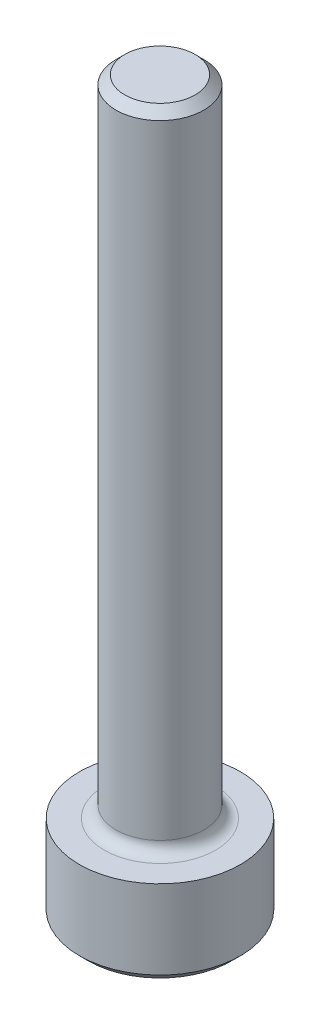
ISO-10303-21;
HEADER;
FILE_DESCRIPTION(('STEP AP214'),'2;1');
FILE_NAME('part.step','',(''),(''),'','','');
FILE_SCHEMA(('AUTOMOTIVE_DESIGN { 1 0 10303 214 1 1 1 1 }'));
ENDSEC;
DATA;
#1=APPLICATION_CONTEXT('core data for automotive mechanical design processes');
#2=APPLICATION_PROTOCOL_DEFINITION('international standard','automotive_design',2000,#1);
#3=PRODUCT_CONTEXT('',#1,'mechanical');
#4=PRODUCT('Part','Part','',(#3));
#5=PRODUCT_RELATED_PRODUCT_CATEGORY('part','',(#4));
#6=PRODUCT_DEFINITION_FORMATION('','',#4);
#7=PRODUCT_DEFINITION_CONTEXT('part definition',#1,'design');
#8=PRODUCT_DEFINITION('design','',#6,#7);
#9=PRODUCT_DEFINITION_SHAPE('','',#8);
#10=(LENGTH_UNIT() NAMED_UNIT(*) SI_UNIT(.MILLI.,.METRE.));
#11=(NAMED_UNIT(*) PLANE_ANGLE_UNIT() SI_UNIT($,.RADIAN.));
#12=(NAMED_UNIT(*) SI_UNIT($,.STERADIAN.) SOLID_ANGLE_UNIT());
#13=UNCERTAINTY_MEASURE_WITH_UNIT(LENGTH_MEASURE(1.E-05),#10,'distance_accuracy_value','');
#14=(GEOMETRIC_REPRESENTATION_CONTEXT(3) GLOBAL_UNCERTAINTY_ASSIGNED_CONTEXT((#13)) GLOBAL_UNIT_ASSIGNED_CONTEXT((#10,
#11,#12)) REPRESENTATION_CONTEXT('',''));
#15=CARTESIAN_POINT('',(0.,0.,0.));
#16=DIRECTION('',(0.,0.,1.));
#17=DIRECTION('',(1.,0.,0.));
#18=AXIS2_PLACEMENT_3D('',#15,#16,#17);
#19=CARTESIAN_POINT('',(0.,22.,0.));
#20=DIRECTION('',(0.,-1.,0.));
#21=DIRECTION('',(0.,0.,-1.));
#22=AXIS2_PLACEMENT_3D('',#19,#20,#21);
#23=CYLINDRICAL_SURFACE('',#22,1.5);
#24=CARTESIAN_POINT('',(0.,21.7,0.));
#25=DIRECTION('',(0.,1.,0.));
#26=DIRECTION('',(0.,0.,1.));
#27=AXIS2_PLACEMENT_3D('',#24,#25,#26);
#28=CIRCLE('',#27,1.5);
#29=CARTESIAN_POINT('',(0.,21.7,1.5));
#30=VERTEX_POINT('',#29);
#31=EDGE_CURVE('E11',#30,#30,#28,.F.);
#32=ORIENTED_EDGE('',*,*,#31,.T.);
#33=EDGE_LOOP('',(#32));
#34=FACE_BOUND('',#33,.T.);
#35=CARTESIAN_POINT('',(0.,0.400000000000001,0.));
#36=DIRECTION('',(0.,1.,0.));
#37=DIRECTION('',(0.,0.,1.));
#38=AXIS2_PLACEMENT_3D('',#35,#36,#37);
#39=CIRCLE('',#38,1.5);
#40=CARTESIAN_POINT('',(0.,0.400000000000001,1.5));
#41=VERTEX_POINT('',#40);
#42=EDGE_CURVE('E143',#41,#41,#39,.T.);
#43=ORIENTED_EDGE('',*,*,#42,.T.);
#44=EDGE_LOOP('',(#43));
#45=FACE_BOUND('',#44,.T.);
#46=ADVANCED_FACE('F33',(#34,#45),#23,.T.);
#47=CARTESIAN_POINT('',(0.,22.,0.));
#48=DIRECTION('',(0.,1.,0.));
#49=DIRECTION('',(0.,0.,1.));
#50=AXIS2_PLACEMENT_3D('',#47,#48,#49);
#51=PLANE('',#50);
#52=CARTESIAN_POINT('',(0.,22.,0.));
#53=DIRECTION('',(0.,1.,0.));
#54=DIRECTION('',(0.,0.,1.));
#55=AXIS2_PLACEMENT_3D('',#52,#53,#54);
#56=CIRCLE('',#55,1.2);
#57=CARTESIAN_POINT('',(0.,22.,1.2));
#58=VERTEX_POINT('',#57);
#59=EDGE_CURVE('E41',#58,#58,#56,.T.);
#60=ORIENTED_EDGE('',*,*,#59,.T.);
#61=EDGE_LOOP('',(#60));
#62=FACE_BOUND('',#61,.T.);
#63=ADVANCED_FACE('F157',(#62),#51,.T.);
#64=CARTESIAN_POINT('',(0.,-3.,0.));
#65=DIRECTION('',(0.,1.,0.));
#66=DIRECTION('',(0.,0.,1.));
#67=AXIS2_PLACEMENT_3D('',#64,#65,#66);
#68=CYLINDRICAL_SURFACE('',#67,2.75);
#69=CARTESIAN_POINT('',(0.,-2.7,0.));
#70=DIRECTION('',(0.,1.,0.));
#71=DIRECTION('',(0.,0.,1.));
#72=AXIS2_PLACEMENT_3D('',#69,#70,#71);
#73=CIRCLE('',#72,2.75);
#74=CARTESIAN_POINT('',(0.,-2.7,2.75));
#75=VERTEX_POINT('',#74);
#76=EDGE_CURVE('E149',#75,#75,#73,.T.);
#77=ORIENTED_EDGE('',*,*,#76,.T.);
#78=EDGE_LOOP('',(#77));
#79=FACE_BOUND('',#78,.T.);
#80=CARTESIAN_POINT('',(0.,0.,0.));
#81=DIRECTION('',(0.,1.,0.));
#82=DIRECTION('',(0.,0.,1.));
#83=AXIS2_PLACEMENT_3D('',#80,#81,#82);
#84=CIRCLE('',#83,2.75);
#85=CARTESIAN_POINT('',(0.,0.,2.75));
#86=VERTEX_POINT('',#85);
#87=EDGE_CURVE('E135',#86,#86,#84,.T.);
#88=ORIENTED_EDGE('',*,*,#87,.F.);
#89=EDGE_LOOP('',(#88));
#90=FACE_BOUND('',#89,.T.);
#91=ADVANCED_FACE('F178',(#79,#90),#68,.T.);
#92=CARTESIAN_POINT('',(0.,-3.,0.));
#93=DIRECTION('',(0.,1.,0.));
#94=DIRECTION('',(0.,0.,1.));
#95=AXIS2_PLACEMENT_3D('',#92,#93,#94);
#96=PLANE('',#95);
#97=DIRECTION('',(-0.866025403784439,0.,-0.5));
#98=VECTOR('',#97,1.);
#99=CARTESIAN_POINT('',(0.,-3.,1.44337567297406));
#100=LINE('',#99,#98);
#101=CARTESIAN_POINT('',(0.,-3.,1.44337567297406));
#102=VERTEX_POINT('',#101);
#103=CARTESIAN_POINT('',(-1.25,-3.,0.721687836487032));
#104=VERTEX_POINT('',#103);
#105=EDGE_CURVE('E122',#102,#104,#100,.T.);
#106=ORIENTED_EDGE('',*,*,#105,.F.);
#107=DIRECTION('',(-0.866025403784439,0.,0.5));
#108=VECTOR('',#107,1.);
#109=CARTESIAN_POINT('',(1.25,-3.,0.721687836487033));
#110=LINE('',#109,#108);
#111=CARTESIAN_POINT('',(1.25,-3.,0.721687836487033));
#112=VERTEX_POINT('',#111);
#113=EDGE_CURVE('E48',#112,#102,#110,.T.);
#114=ORIENTED_EDGE('',*,*,#113,.F.);
#115=DIRECTION('',(0.,0.,1.));
#116=VECTOR('',#115,1.);
#117=CARTESIAN_POINT('',(1.25,-3.,-0.721687836487033));
#118=LINE('',#117,#116);
#119=CARTESIAN_POINT('',(1.25,-3.,-0.721687836487033));
#120=VERTEX_POINT('',#119);
#121=EDGE_CURVE('E131',#120,#112,#118,.T.);
#122=ORIENTED_EDGE('',*,*,#121,.F.);
#123=DIRECTION('',(0.866025403784439,0.,0.5));
#124=VECTOR('',#123,1.);
#125=CARTESIAN_POINT('',(0.,-3.,-1.44337567297406));
#126=LINE('',#125,#124);
#127=CARTESIAN_POINT('',(0.,-3.,-1.44337567297406));
#128=VERTEX_POINT('',#127);
#129=EDGE_CURVE('E129',#128,#120,#126,.T.);
#130=ORIENTED_EDGE('',*,*,#129,.F.);
#131=DIRECTION('',(0.866025403784439,0.,-0.5));
#132=VECTOR('',#131,1.);
#133=CARTESIAN_POINT('',(-1.25,-3.,-0.721687836487033));
#134=LINE('',#133,#132);
#135=CARTESIAN_POINT('',(-1.25,-3.,-0.721687836487033));
#136=VERTEX_POINT('',#135);
#137=EDGE_CURVE('E96',#136,#128,#134,.T.);
#138=ORIENTED_EDGE('',*,*,#137,.F.);
#139=DIRECTION('',(0.,0.,-1.));
#140=VECTOR('',#139,1.);
#141=CARTESIAN_POINT('',(-1.25,-3.,0.721687836487032));
#142=LINE('',#141,#140);
#143=EDGE_CURVE('E125',#104,#136,#142,.T.);
#144=ORIENTED_EDGE('',*,*,#143,.F.);
#145=EDGE_LOOP('',(#106,#114,#122,#130,#138,#144));
#146=FACE_BOUND('',#145,.T.);
#147=CARTESIAN_POINT('',(0.,-3.,0.));
#148=DIRECTION('',(0.,1.,0.));
#149=DIRECTION('',(0.,0.,1.));
#150=AXIS2_PLACEMENT_3D('',#147,#148,#149);
#151=CIRCLE('',#150,2.45);
#152=CARTESIAN_POINT('',(0.,-3.,2.45));
#153=VERTEX_POINT('',#152);
#154=EDGE_CURVE('E152',#153,#153,#151,.F.);
#155=ORIENTED_EDGE('',*,*,#154,.T.);
#156=EDGE_LOOP('',(#155));
#157=FACE_BOUND('',#156,.T.);
#158=ADVANCED_FACE('F189',(#146,#157),#96,.F.);
#159=CARTESIAN_POINT('',(0.,0.,0.));
#160=DIRECTION('',(0.,1.,0.));
#161=DIRECTION('',(0.,0.,1.));
#162=AXIS2_PLACEMENT_3D('',#159,#160,#161);
#163=PLANE('',#162);
#164=CARTESIAN_POINT('',(0.,0.,0.));
#165=DIRECTION('',(0.,1.,0.));
#166=DIRECTION('',(0.,0.,1.));
#167=AXIS2_PLACEMENT_3D('',#164,#165,#166);
#168=CIRCLE('',#167,1.9);
#169=CARTESIAN_POINT('',(0.,0.,1.9));
#170=VERTEX_POINT('',#169);
#171=EDGE_CURVE('E146',#170,#170,#168,.F.);
#172=ORIENTED_EDGE('',*,*,#171,.T.);
#173=EDGE_LOOP('',(#172));
#174=FACE_BOUND('',#173,.T.);
#175=ORIENTED_EDGE('',*,*,#87,.T.);
#176=EDGE_LOOP('',(#175));
#177=FACE_BOUND('',#176,.T.);
#178=ADVANCED_FACE('F184',(#174,#177),#163,.T.);
#179=CARTESIAN_POINT('',(0.,0.400000000000001,0.));
#180=DIRECTION('',(0.,1.,0.));
#181=DIRECTION('',(0.,0.,1.));
#182=AXIS2_PLACEMENT_3D('',#179,#180,#181);
#183=TOROIDAL_SURFACE('',#182,1.9,0.4);
#184=ORIENTED_EDGE('',*,*,#171,.F.);
#185=EDGE_LOOP('',(#184));
#186=FACE_BOUND('',#185,.T.);
#187=ORIENTED_EDGE('',*,*,#42,.F.);
#188=EDGE_LOOP('',(#187));
#189=FACE_BOUND('',#188,.T.);
#190=ADVANCED_FACE('F169',(#186,#189),#183,.F.);
#191=CARTESIAN_POINT('',(0.,-2.7,0.));
#192=DIRECTION('',(0.,1.,0.));
#193=DIRECTION('',(0.,0.,1.));
#194=AXIS2_PLACEMENT_3D('',#191,#192,#193);
#195=CONICAL_SURFACE('',#194,2.75,0.785398163397453);
#196=ORIENTED_EDGE('',*,*,#154,.F.);
#197=EDGE_LOOP('',(#196));
#198=FACE_BOUND('',#197,.T.);
#199=ORIENTED_EDGE('',*,*,#76,.F.);
#200=EDGE_LOOP('',(#199));
#201=FACE_BOUND('',#200,.T.);
#202=ADVANCED_FACE('F161',(#198,#201),#195,.T.);
#203=CARTESIAN_POINT('',(0.,22.,0.));
#204=DIRECTION('',(0.,-1.,0.));
#205=DIRECTION('',(0.,0.,-1.));
#206=AXIS2_PLACEMENT_3D('',#203,#204,#205);
#207=CONICAL_SURFACE('',#206,1.2,0.785398163397452);
#208=ORIENTED_EDGE('',*,*,#31,.F.);
#209=EDGE_LOOP('',(#208));
#210=FACE_BOUND('',#209,.T.);
#211=ORIENTED_EDGE('',*,*,#59,.F.);
#212=EDGE_LOOP('',(#211));
#213=FACE_BOUND('',#212,.T.);
#214=ADVANCED_FACE('F35',(#210,#213),#207,.T.);
#215=CARTESIAN_POINT('',(1.25,-0.5,0.721687836487033));
#216=DIRECTION('',(0.5,0.,0.866025403784439));
#217=DIRECTION('',(0.866025403784439,0.,-0.5));
#218=AXIS2_PLACEMENT_3D('',#215,#216,#217);
#219=PLANE('',#218);
#220=ORIENTED_EDGE('',*,*,#113,.T.);
#221=DIRECTION('',(0.,-1.,0.));
#222=VECTOR('',#221,1.);
#223=CARTESIAN_POINT('',(0.,-0.5,1.44337567297406));
#224=LINE('',#223,#222);
#225=CARTESIAN_POINT('',(0.,-0.5,1.44337567297406));
#226=VERTEX_POINT('',#225);
#227=EDGE_CURVE('E78',#226,#102,#224,.T.);
#228=ORIENTED_EDGE('',*,*,#227,.F.);
#229=DIRECTION('',(-0.866025403784439,0.,0.5));
#230=VECTOR('',#229,1.);
#231=CARTESIAN_POINT('',(1.25,-0.5,0.721687836487033));
#232=LINE('',#231,#230);
#233=CARTESIAN_POINT('',(1.25,-0.5,0.721687836487033));
#234=VERTEX_POINT('',#233);
#235=EDGE_CURVE('E133',#234,#226,#232,.T.);
#236=ORIENTED_EDGE('',*,*,#235,.F.);
#237=DIRECTION('',(0.,-1.,0.));
#238=VECTOR('',#237,1.);
#239=CARTESIAN_POINT('',(1.25,-0.5,0.721687836487033));
#240=LINE('',#239,#238);
#241=EDGE_CURVE('E56',#234,#112,#240,.T.);
#242=ORIENTED_EDGE('',*,*,#241,.T.);
#243=EDGE_LOOP('',(#220,#228,#236,#242));
#244=FACE_BOUND('',#243,.T.);
#245=ADVANCED_FACE('F160',(#244),#219,.F.);
#246=CARTESIAN_POINT('',(1.25,-0.5,-0.721687836487033));
#247=DIRECTION('',(1.,0.,0.));
#248=DIRECTION('',(0.,0.,-1.));
#249=AXIS2_PLACEMENT_3D('',#246,#247,#248);
#250=PLANE('',#249);
#251=ORIENTED_EDGE('',*,*,#121,.T.);
#252=ORIENTED_EDGE('',*,*,#241,.F.);
#253=DIRECTION('',(0.,0.,1.));
#254=VECTOR('',#253,1.);
#255=CARTESIAN_POINT('',(1.25,-0.5,-0.721687836487033));
#256=LINE('',#255,#254);
#257=CARTESIAN_POINT('',(1.25,-0.5,-0.721687836487033));
#258=VERTEX_POINT('',#257);
#259=EDGE_CURVE('E108',#258,#234,#256,.T.);
#260=ORIENTED_EDGE('',*,*,#259,.F.);
#261=DIRECTION('',(0.,-1.,0.));
#262=VECTOR('',#261,1.);
#263=CARTESIAN_POINT('',(1.25,-0.5,-0.721687836487033));
#264=LINE('',#263,#262);
#265=EDGE_CURVE('E100',#258,#120,#264,.T.);
#266=ORIENTED_EDGE('',*,*,#265,.T.);
#267=EDGE_LOOP('',(#251,#252,#260,#266));
#268=FACE_BOUND('',#267,.T.);
#269=ADVANCED_FACE('F167',(#268),#250,.F.);
#270=CARTESIAN_POINT('',(0.,-0.5,-1.44337567297406));
#271=DIRECTION('',(0.5,0.,-0.866025403784439));
#272=DIRECTION('',(-0.866025403784439,0.,-0.5));
#273=AXIS2_PLACEMENT_3D('',#270,#271,#272);
#274=PLANE('',#273);
#275=ORIENTED_EDGE('',*,*,#129,.T.);
#276=ORIENTED_EDGE('',*,*,#265,.F.);
#277=DIRECTION('',(0.866025403784439,0.,0.5));
#278=VECTOR('',#277,1.);
#279=CARTESIAN_POINT('',(0.,-0.5,-1.44337567297406));
#280=LINE('',#279,#278);
#281=CARTESIAN_POINT('',(0.,-0.5,-1.44337567297406));
#282=VERTEX_POINT('',#281);
#283=EDGE_CURVE('E104',#282,#258,#280,.T.);
#284=ORIENTED_EDGE('',*,*,#283,.F.);
#285=DIRECTION('',(0.,-1.,0.));
#286=VECTOR('',#285,1.);
#287=CARTESIAN_POINT('',(0.,-0.5,-1.44337567297406));
#288=LINE('',#287,#286);
#289=EDGE_CURVE('E89',#282,#128,#288,.T.);
#290=ORIENTED_EDGE('',*,*,#289,.T.);
#291=EDGE_LOOP('',(#275,#276,#284,#290));
#292=FACE_BOUND('',#291,.T.);
#293=ADVANCED_FACE('F105',(#292),#274,.F.);
#294=CARTESIAN_POINT('',(-1.25,-0.5,-0.721687836487033));
#295=DIRECTION('',(-0.5,0.,-0.866025403784439));
#296=DIRECTION('',(-0.866025403784439,0.,0.5));
#297=AXIS2_PLACEMENT_3D('',#294,#295,#296);
#298=PLANE('',#297);
#299=ORIENTED_EDGE('',*,*,#137,.T.);
#300=ORIENTED_EDGE('',*,*,#289,.F.);
#301=DIRECTION('',(0.866025403784439,0.,-0.5));
#302=VECTOR('',#301,1.);
#303=CARTESIAN_POINT('',(-1.25,-0.5,-0.721687836487033));
#304=LINE('',#303,#302);
#305=CARTESIAN_POINT('',(-1.25,-0.5,-0.721687836487033));
#306=VERTEX_POINT('',#305);
#307=EDGE_CURVE('E93',#306,#282,#304,.T.);
#308=ORIENTED_EDGE('',*,*,#307,.F.);
#309=DIRECTION('',(0.,-1.,0.));
#310=VECTOR('',#309,1.);
#311=CARTESIAN_POINT('',(-1.25,-0.5,-0.721687836487033));
#312=LINE('',#311,#310);
#313=EDGE_CURVE('E101',#306,#136,#312,.T.);
#314=ORIENTED_EDGE('',*,*,#313,.T.);
#315=EDGE_LOOP('',(#299,#300,#308,#314));
#316=FACE_BOUND('',#315,.T.);
#317=ADVANCED_FACE('F91',(#316),#298,.F.);
#318=CARTESIAN_POINT('',(-1.25,-0.5,0.721687836487032));
#319=DIRECTION('',(-1.,0.,0.));
#320=DIRECTION('',(0.,0.,1.));
#321=AXIS2_PLACEMENT_3D('',#318,#319,#320);
#322=PLANE('',#321);
#323=ORIENTED_EDGE('',*,*,#143,.T.);
#324=ORIENTED_EDGE('',*,*,#313,.F.);
#325=DIRECTION('',(0.,0.,-1.));
#326=VECTOR('',#325,1.);
#327=CARTESIAN_POINT('',(-1.25,-0.5,0.721687836487032));
#328=LINE('',#327,#326);
#329=CARTESIAN_POINT('',(-1.25,-0.5,0.721687836487032));
#330=VERTEX_POINT('',#329);
#331=EDGE_CURVE('E114',#330,#306,#328,.T.);
#332=ORIENTED_EDGE('',*,*,#331,.F.);
#333=DIRECTION('',(0.,-1.,0.));
#334=VECTOR('',#333,1.);
#335=CARTESIAN_POINT('',(-1.25,-0.5,0.721687836487032));
#336=LINE('',#335,#334);
#337=EDGE_CURVE('E138',#330,#104,#336,.T.);
#338=ORIENTED_EDGE('',*,*,#337,.T.);
#339=EDGE_LOOP('',(#323,#324,#332,#338));
#340=FACE_BOUND('',#339,.T.);
#341=ADVANCED_FACE('F209',(#340),#322,.F.);
#342=CARTESIAN_POINT('',(0.,-0.5,1.44337567297406));
#343=DIRECTION('',(-0.5,0.,0.866025403784439));
#344=DIRECTION('',(0.866025403784439,0.,0.5));
#345=AXIS2_PLACEMENT_3D('',#342,#343,#344);
#346=PLANE('',#345);
#347=ORIENTED_EDGE('',*,*,#105,.T.);
#348=ORIENTED_EDGE('',*,*,#337,.F.);
#349=DIRECTION('',(-0.866025403784439,0.,-0.5));
#350=VECTOR('',#349,1.);
#351=CARTESIAN_POINT('',(0.,-0.5,1.44337567297406));
#352=LINE('',#351,#350);
#353=EDGE_CURVE('E116',#226,#330,#352,.T.);
#354=ORIENTED_EDGE('',*,*,#353,.F.);
#355=ORIENTED_EDGE('',*,*,#227,.T.);
#356=EDGE_LOOP('',(#347,#348,#354,#355));
#357=FACE_BOUND('',#356,.T.);
#358=ADVANCED_FACE('F206',(#357),#346,.F.);
#359=CARTESIAN_POINT('',(0.,-0.5,0.));
#360=DIRECTION('',(0.,-1.,0.));
#361=DIRECTION('',(0.,0.,-1.));
#362=AXIS2_PLACEMENT_3D('',#359,#360,#361);
#363=PLANE('',#362);
#364=ORIENTED_EDGE('',*,*,#235,.T.);
#365=ORIENTED_EDGE('',*,*,#353,.T.);
#366=ORIENTED_EDGE('',*,*,#331,.T.);
#367=ORIENTED_EDGE('',*,*,#307,.T.);
#368=ORIENTED_EDGE('',*,*,#283,.T.);
#369=ORIENTED_EDGE('',*,*,#259,.T.);
#370=EDGE_LOOP('',(#364,#365,#366,#367,#368,#369));
#371=FACE_BOUND('',#370,.T.);
#372=ADVANCED_FACE('F111',(#371),#363,.T.);
#373=CLOSED_SHELL('',(#46,#63,#91,#158,#178,#190,#202,#214,#245,#269,#293,#317,#341,#358,#372));
#374=MANIFOLD_SOLID_BREP('B2',#373);
#375=ADVANCED_BREP_SHAPE_REPRESENTATION('',(#18,#374),#14);
#376=SHAPE_DEFINITION_REPRESENTATION(#9,#375);
ENDSEC;
END-ISO-10303-21;
